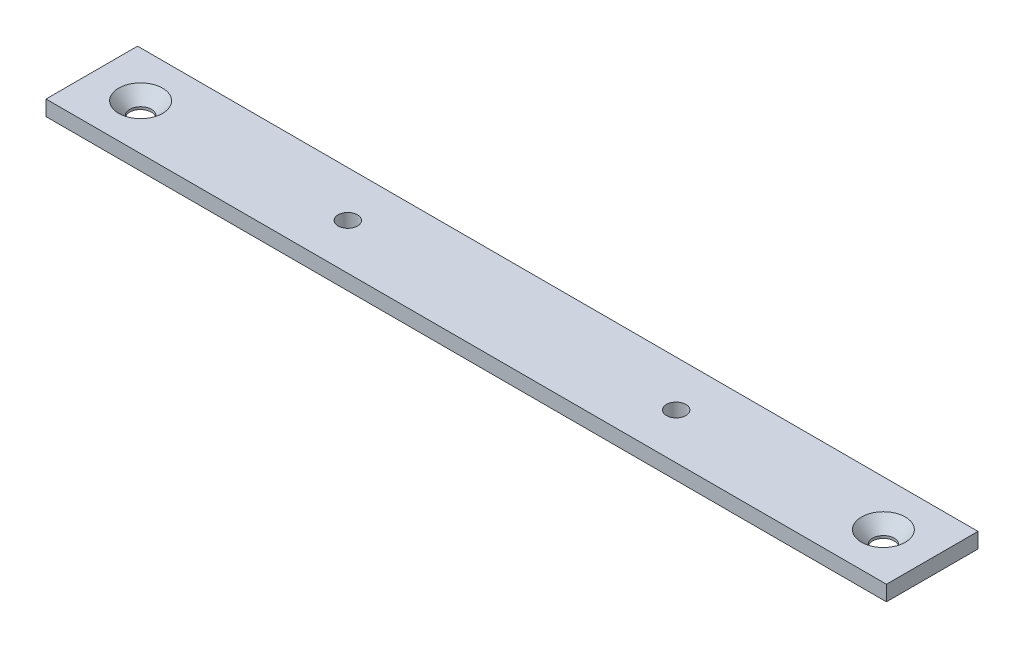
ISO-10303-21;
HEADER;
FILE_DESCRIPTION(('STEP AP214'),'2;1');
FILE_NAME('part.step','',(''),(''),'','','');
FILE_SCHEMA(('AUTOMOTIVE_DESIGN { 1 0 10303 214 1 1 1 1 }'));
ENDSEC;
DATA;
#1=APPLICATION_CONTEXT('core data for automotive mechanical design processes');
#2=APPLICATION_PROTOCOL_DEFINITION('international standard','automotive_design',2000,#1);
#3=PRODUCT_CONTEXT('',#1,'mechanical');
#4=PRODUCT('Part','Part','',(#3));
#5=PRODUCT_RELATED_PRODUCT_CATEGORY('part','',(#4));
#6=PRODUCT_DEFINITION_FORMATION('','',#4);
#7=PRODUCT_DEFINITION_CONTEXT('part definition',#1,'design');
#8=PRODUCT_DEFINITION('design','',#6,#7);
#9=PRODUCT_DEFINITION_SHAPE('','',#8);
#10=(LENGTH_UNIT() NAMED_UNIT(*) SI_UNIT(.MILLI.,.METRE.));
#11=(NAMED_UNIT(*) PLANE_ANGLE_UNIT() SI_UNIT($,.RADIAN.));
#12=(NAMED_UNIT(*) SI_UNIT($,.STERADIAN.) SOLID_ANGLE_UNIT());
#13=UNCERTAINTY_MEASURE_WITH_UNIT(LENGTH_MEASURE(1.E-05),#10,'distance_accuracy_value','');
#14=(GEOMETRIC_REPRESENTATION_CONTEXT(3) GLOBAL_UNCERTAINTY_ASSIGNED_CONTEXT((#13)) GLOBAL_UNIT_ASSIGNED_CONTEXT((#10,
#11,#12)) REPRESENTATION_CONTEXT('',''));
#15=CARTESIAN_POINT('',(0.,0.,0.));
#16=DIRECTION('',(0.,0.,1.));
#17=DIRECTION('',(1.,0.,0.));
#18=AXIS2_PLACEMENT_3D('',#15,#16,#17);
#19=CARTESIAN_POINT('',(87.4395,3.175,9.525));
#20=DIRECTION('',(-1.,0.,0.));
#21=DIRECTION('',(0.,0.,1.));
#22=AXIS2_PLACEMENT_3D('',#19,#20,#21);
#23=PLANE('',#22);
#24=DIRECTION('',(0.,0.,-1.));
#25=VECTOR('',#24,1.);
#26=CARTESIAN_POINT('',(87.4395,0.,9.525));
#27=LINE('',#26,#25);
#28=CARTESIAN_POINT('',(87.4395,0.,9.525));
#29=VERTEX_POINT('',#28);
#30=CARTESIAN_POINT('',(87.4395,0.,-9.525));
#31=VERTEX_POINT('',#30);
#32=EDGE_CURVE('E104',#29,#31,#27,.T.);
#33=ORIENTED_EDGE('',*,*,#32,.T.);
#34=DIRECTION('',(0.,-1.,0.));
#35=VECTOR('',#34,1.);
#36=CARTESIAN_POINT('',(87.4395,3.175,-9.525));
#37=LINE('',#36,#35);
#38=CARTESIAN_POINT('',(87.4395,3.175,-9.525));
#39=VERTEX_POINT('',#38);
#40=EDGE_CURVE('E11',#39,#31,#37,.T.);
#41=ORIENTED_EDGE('',*,*,#40,.F.);
#42=DIRECTION('',(0.,0.,-1.));
#43=VECTOR('',#42,1.);
#44=CARTESIAN_POINT('',(87.4395,3.175,9.525));
#45=LINE('',#44,#43);
#46=CARTESIAN_POINT('',(87.4395,3.175,9.525));
#47=VERTEX_POINT('',#46);
#48=EDGE_CURVE('E91',#47,#39,#45,.T.);
#49=ORIENTED_EDGE('',*,*,#48,.F.);
#50=DIRECTION('',(0.,-1.,0.));
#51=VECTOR('',#50,1.);
#52=CARTESIAN_POINT('',(87.4395,3.175,9.525));
#53=LINE('',#52,#51);
#54=EDGE_CURVE('E100',#47,#29,#53,.T.);
#55=ORIENTED_EDGE('',*,*,#54,.T.);
#56=EDGE_LOOP('',(#33,#41,#49,#55));
#57=FACE_BOUND('',#56,.T.);
#58=ADVANCED_FACE('F39',(#57),#23,.F.);
#59=CARTESIAN_POINT('',(-87.4395,3.175,-9.525));
#60=DIRECTION('',(0.,0.,1.));
#61=DIRECTION('',(1.,0.,0.));
#62=AXIS2_PLACEMENT_3D('',#59,#60,#61);
#63=PLANE('',#62);
#64=DIRECTION('',(-1.,0.,0.));
#65=VECTOR('',#64,1.);
#66=CARTESIAN_POINT('',(-87.4395,0.,-9.525));
#67=LINE('',#66,#65);
#68=CARTESIAN_POINT('',(-87.4395,0.,-9.525));
#69=VERTEX_POINT('',#68);
#70=EDGE_CURVE('E95',#31,#69,#67,.T.);
#71=ORIENTED_EDGE('',*,*,#70,.T.);
#72=DIRECTION('',(0.,-1.,0.));
#73=VECTOR('',#72,1.);
#74=CARTESIAN_POINT('',(-87.4395,3.175,-9.525));
#75=LINE('',#74,#73);
#76=CARTESIAN_POINT('',(-87.4395,3.175,-9.525));
#77=VERTEX_POINT('',#76);
#78=EDGE_CURVE('E48',#77,#69,#75,.T.);
#79=ORIENTED_EDGE('',*,*,#78,.F.);
#80=DIRECTION('',(-1.,0.,0.));
#81=VECTOR('',#80,1.);
#82=CARTESIAN_POINT('',(-87.4395,3.175,-9.525));
#83=LINE('',#82,#81);
#84=EDGE_CURVE('E86',#39,#77,#83,.T.);
#85=ORIENTED_EDGE('',*,*,#84,.F.);
#86=ORIENTED_EDGE('',*,*,#40,.T.);
#87=EDGE_LOOP('',(#71,#79,#85,#86));
#88=FACE_BOUND('',#87,.T.);
#89=ADVANCED_FACE('F94',(#88),#63,.F.);
#90=CARTESIAN_POINT('',(-87.4395,3.175,9.525));
#91=DIRECTION('',(1.,0.,0.));
#92=DIRECTION('',(0.,0.,-1.));
#93=AXIS2_PLACEMENT_3D('',#90,#91,#92);
#94=PLANE('',#93);
#95=DIRECTION('',(0.,0.,1.));
#96=VECTOR('',#95,1.);
#97=CARTESIAN_POINT('',(-87.4395,0.,9.525));
#98=LINE('',#97,#96);
#99=CARTESIAN_POINT('',(-87.4395,0.,9.525));
#100=VERTEX_POINT('',#99);
#101=EDGE_CURVE('E73',#69,#100,#98,.T.);
#102=ORIENTED_EDGE('',*,*,#101,.T.);
#103=DIRECTION('',(0.,-1.,0.));
#104=VECTOR('',#103,1.);
#105=CARTESIAN_POINT('',(-87.4395,3.175,9.525));
#106=LINE('',#105,#104);
#107=CARTESIAN_POINT('',(-87.4395,3.175,9.525));
#108=VERTEX_POINT('',#107);
#109=EDGE_CURVE('E96',#108,#100,#106,.T.);
#110=ORIENTED_EDGE('',*,*,#109,.F.);
#111=DIRECTION('',(0.,0.,1.));
#112=VECTOR('',#111,1.);
#113=CARTESIAN_POINT('',(-87.4395,3.175,9.525));
#114=LINE('',#113,#112);
#115=EDGE_CURVE('E89',#77,#108,#114,.T.);
#116=ORIENTED_EDGE('',*,*,#115,.F.);
#117=ORIENTED_EDGE('',*,*,#78,.T.);
#118=EDGE_LOOP('',(#102,#110,#116,#117));
#119=FACE_BOUND('',#118,.T.);
#120=ADVANCED_FACE('F98',(#119),#94,.F.);
#121=CARTESIAN_POINT('',(-87.4395,3.175,9.525));
#122=DIRECTION('',(0.,0.,-1.));
#123=DIRECTION('',(-1.,0.,0.));
#124=AXIS2_PLACEMENT_3D('',#121,#122,#123);
#125=PLANE('',#124);
#126=DIRECTION('',(1.,0.,0.));
#127=VECTOR('',#126,1.);
#128=CARTESIAN_POINT('',(-87.4395,0.,9.525));
#129=LINE('',#128,#127);
#130=EDGE_CURVE('E79',#100,#29,#129,.T.);
#131=ORIENTED_EDGE('',*,*,#130,.T.);
#132=ORIENTED_EDGE('',*,*,#54,.F.);
#133=DIRECTION('',(1.,0.,0.));
#134=VECTOR('',#133,1.);
#135=CARTESIAN_POINT('',(-87.4395,3.175,9.525));
#136=LINE('',#135,#134);
#137=EDGE_CURVE('E56',#108,#47,#136,.T.);
#138=ORIENTED_EDGE('',*,*,#137,.F.);
#139=ORIENTED_EDGE('',*,*,#109,.T.);
#140=EDGE_LOOP('',(#131,#132,#138,#139));
#141=FACE_BOUND('',#140,.T.);
#142=ADVANCED_FACE('F112',(#141),#125,.F.);
#143=CARTESIAN_POINT('',(87.4395,3.175,-9.525));
#144=DIRECTION('',(0.,-1.,0.));
#145=DIRECTION('',(0.,0.,-1.));
#146=AXIS2_PLACEMENT_3D('',#143,#144,#145);
#147=PLANE('',#146);
#148=CARTESIAN_POINT('',(-77.2795,3.175,0.));
#149=DIRECTION('',(0.,1.,0.));
#150=DIRECTION('',(0.,0.,1.));
#151=AXIS2_PLACEMENT_3D('',#148,#149,#150);
#152=CIRCLE('',#151,4.5593);
#153=CARTESIAN_POINT('',(-77.2795,3.175,4.5593));
#154=VERTEX_POINT('',#153);
#155=EDGE_CURVE('E141',#154,#154,#152,.T.);
#156=ORIENTED_EDGE('',*,*,#155,.F.);
#157=EDGE_LOOP('',(#156));
#158=FACE_BOUND('',#157,.T.);
#159=CARTESIAN_POINT('',(77.2794999999999,3.175,0.));
#160=DIRECTION('',(0.,1.,0.));
#161=DIRECTION('',(0.,0.,1.));
#162=AXIS2_PLACEMENT_3D('',#159,#160,#161);
#163=CIRCLE('',#162,4.5593);
#164=CARTESIAN_POINT('',(77.2794999999999,3.175,4.5593));
#165=VERTEX_POINT('',#164);
#166=EDGE_CURVE('E132',#165,#165,#163,.T.);
#167=ORIENTED_EDGE('',*,*,#166,.F.);
#168=EDGE_LOOP('',(#167));
#169=FACE_BOUND('',#168,.T.);
#170=CARTESIAN_POINT('',(-34.163,3.175,0.));
#171=DIRECTION('',(0.,1.,0.));
#172=DIRECTION('',(0.,0.,1.));
#173=AXIS2_PLACEMENT_3D('',#170,#171,#172);
#174=CIRCLE('',#173,2.0193);
#175=CARTESIAN_POINT('',(-34.163,3.175,2.0193));
#176=VERTEX_POINT('',#175);
#177=EDGE_CURVE('E123',#176,#176,#174,.T.);
#178=ORIENTED_EDGE('',*,*,#177,.F.);
#179=EDGE_LOOP('',(#178));
#180=FACE_BOUND('',#179,.T.);
#181=CARTESIAN_POINT('',(34.163,3.175,0.));
#182=DIRECTION('',(0.,1.,0.));
#183=DIRECTION('',(0.,0.,1.));
#184=AXIS2_PLACEMENT_3D('',#181,#182,#183);
#185=CIRCLE('',#184,2.0193);
#186=CARTESIAN_POINT('',(34.163,3.175,2.0193));
#187=VERTEX_POINT('',#186);
#188=EDGE_CURVE('E120',#187,#187,#185,.T.);
#189=ORIENTED_EDGE('',*,*,#188,.F.);
#190=EDGE_LOOP('',(#189));
#191=FACE_BOUND('',#190,.T.);
#192=ORIENTED_EDGE('',*,*,#48,.T.);
#193=ORIENTED_EDGE('',*,*,#84,.T.);
#194=ORIENTED_EDGE('',*,*,#115,.T.);
#195=ORIENTED_EDGE('',*,*,#137,.T.);
#196=EDGE_LOOP('',(#192,#193,#194,#195));
#197=FACE_BOUND('',#196,.T.);
#198=ADVANCED_FACE('F87',(#158,#169,#180,#191,#197),#147,.F.);
#199=CARTESIAN_POINT('',(87.4395,0.,-9.525));
#200=DIRECTION('',(0.,-1.,0.));
#201=DIRECTION('',(0.,0.,-1.));
#202=AXIS2_PLACEMENT_3D('',#199,#200,#201);
#203=PLANE('',#202);
#204=CARTESIAN_POINT('',(-77.2795,1.18221404887819E-12,0.));
#205=DIRECTION('',(0.,1.,0.));
#206=DIRECTION('',(0.,0.,1.));
#207=AXIS2_PLACEMENT_3D('',#204,#205,#206);
#208=CIRCLE('',#207,2.2479);
#209=CARTESIAN_POINT('',(-77.2795,1.18221404887819E-12,2.2479));
#210=VERTEX_POINT('',#209);
#211=EDGE_CURVE('E135',#210,#210,#208,.T.);
#212=ORIENTED_EDGE('',*,*,#211,.T.);
#213=EDGE_LOOP('',(#212));
#214=FACE_BOUND('',#213,.T.);
#215=CARTESIAN_POINT('',(77.2794999999999,1.18221404887819E-12,0.));
#216=DIRECTION('',(0.,1.,0.));
#217=DIRECTION('',(0.,0.,1.));
#218=AXIS2_PLACEMENT_3D('',#215,#216,#217);
#219=CIRCLE('',#218,2.2479);
#220=CARTESIAN_POINT('',(77.2794999999999,1.18221404887819E-12,2.2479));
#221=VERTEX_POINT('',#220);
#222=EDGE_CURVE('E126',#221,#221,#219,.T.);
#223=ORIENTED_EDGE('',*,*,#222,.T.);
#224=EDGE_LOOP('',(#223));
#225=FACE_BOUND('',#224,.T.);
#226=CARTESIAN_POINT('',(-34.163,0.,0.));
#227=DIRECTION('',(0.,-1.,0.));
#228=DIRECTION('',(0.,0.,-1.));
#229=AXIS2_PLACEMENT_3D('',#226,#227,#228);
#230=CIRCLE('',#229,2.0193);
#231=CARTESIAN_POINT('',(-34.163,0.,-2.0193));
#232=VERTEX_POINT('',#231);
#233=EDGE_CURVE('E42',#232,#232,#230,.T.);
#234=ORIENTED_EDGE('',*,*,#233,.F.);
#235=EDGE_LOOP('',(#234));
#236=FACE_BOUND('',#235,.T.);
#237=CARTESIAN_POINT('',(34.163,0.,0.));
#238=DIRECTION('',(0.,-1.,0.));
#239=DIRECTION('',(0.,0.,-1.));
#240=AXIS2_PLACEMENT_3D('',#237,#238,#239);
#241=CIRCLE('',#240,2.0193);
#242=CARTESIAN_POINT('',(34.163,0.,-2.0193));
#243=VERTEX_POINT('',#242);
#244=EDGE_CURVE('E107',#243,#243,#241,.T.);
#245=ORIENTED_EDGE('',*,*,#244,.F.);
#246=EDGE_LOOP('',(#245));
#247=FACE_BOUND('',#246,.T.);
#248=ORIENTED_EDGE('',*,*,#32,.F.);
#249=ORIENTED_EDGE('',*,*,#130,.F.);
#250=ORIENTED_EDGE('',*,*,#101,.F.);
#251=ORIENTED_EDGE('',*,*,#70,.F.);
#252=EDGE_LOOP('',(#248,#249,#250,#251));
#253=FACE_BOUND('',#252,.T.);
#254=ADVANCED_FACE('F115',(#214,#225,#236,#247,#253),#203,.T.);
#255=CARTESIAN_POINT('',(34.163,3.175,0.));
#256=DIRECTION('',(0.,1.,0.));
#257=DIRECTION('',(0.,0.,1.));
#258=AXIS2_PLACEMENT_3D('',#255,#256,#257);
#259=CYLINDRICAL_SURFACE('',#258,2.0193);
#260=ORIENTED_EDGE('',*,*,#244,.T.);
#261=EDGE_LOOP('',(#260));
#262=FACE_BOUND('',#261,.T.);
#263=ORIENTED_EDGE('',*,*,#188,.T.);
#264=EDGE_LOOP('',(#263));
#265=FACE_BOUND('',#264,.T.);
#266=ADVANCED_FACE('F156',(#262,#265),#259,.F.);
#267=CARTESIAN_POINT('',(-34.163,3.175,0.));
#268=DIRECTION('',(0.,1.,0.));
#269=DIRECTION('',(0.,0.,1.));
#270=AXIS2_PLACEMENT_3D('',#267,#268,#269);
#271=CYLINDRICAL_SURFACE('',#270,2.0193);
#272=ORIENTED_EDGE('',*,*,#233,.T.);
#273=EDGE_LOOP('',(#272));
#274=FACE_BOUND('',#273,.T.);
#275=ORIENTED_EDGE('',*,*,#177,.T.);
#276=EDGE_LOOP('',(#275));
#277=FACE_BOUND('',#276,.T.);
#278=ADVANCED_FACE('F158',(#274,#277),#271,.F.);
#279=CARTESIAN_POINT('',(77.2794999999999,3.175,0.));
#280=DIRECTION('',(0.,1.,0.));
#281=DIRECTION('',(0.,0.,1.));
#282=AXIS2_PLACEMENT_3D('',#279,#280,#281);
#283=CYLINDRICAL_SURFACE('',#282,2.24789999999999);
#284=ORIENTED_EDGE('',*,*,#222,.F.);
#285=EDGE_LOOP('',(#284));
#286=FACE_BOUND('',#285,.T.);
#287=CARTESIAN_POINT('',(77.2794999999999,0.516038463549351,0.));
#288=DIRECTION('',(0.,1.,0.));
#289=DIRECTION('',(0.,0.,1.));
#290=AXIS2_PLACEMENT_3D('',#287,#288,#289);
#291=CIRCLE('',#290,2.24789999999998);
#292=CARTESIAN_POINT('',(77.2794999999999,0.516038463549351,2.24789999999998));
#293=VERTEX_POINT('',#292);
#294=EDGE_CURVE('E129',#293,#293,#291,.T.);
#295=ORIENTED_EDGE('',*,*,#294,.T.);
#296=EDGE_LOOP('',(#295));
#297=FACE_BOUND('',#296,.T.);
#298=ADVANCED_FACE('F165',(#286,#297),#283,.F.);
#299=CARTESIAN_POINT('',(77.2794999999999,3.175,0.));
#300=DIRECTION('',(0.,1.,0.));
#301=DIRECTION('',(0.,0.,1.));
#302=AXIS2_PLACEMENT_3D('',#299,#300,#301);
#303=CONICAL_SURFACE('',#302,4.5593,0.715584993317677);
#304=ORIENTED_EDGE('',*,*,#294,.F.);
#305=EDGE_LOOP('',(#304));
#306=FACE_BOUND('',#305,.T.);
#307=ORIENTED_EDGE('',*,*,#166,.T.);
#308=EDGE_LOOP('',(#307));
#309=FACE_BOUND('',#308,.T.);
#310=ADVANCED_FACE('F255',(#306,#309),#303,.F.);
#311=CARTESIAN_POINT('',(-77.2795,3.175,0.));
#312=DIRECTION('',(0.,1.,0.));
#313=DIRECTION('',(0.,0.,1.));
#314=AXIS2_PLACEMENT_3D('',#311,#312,#313);
#315=CYLINDRICAL_SURFACE('',#314,2.24789999999999);
#316=ORIENTED_EDGE('',*,*,#211,.F.);
#317=EDGE_LOOP('',(#316));
#318=FACE_BOUND('',#317,.T.);
#319=CARTESIAN_POINT('',(-77.2795,0.516038463549351,0.));
#320=DIRECTION('',(0.,1.,0.));
#321=DIRECTION('',(0.,0.,1.));
#322=AXIS2_PLACEMENT_3D('',#319,#320,#321);
#323=CIRCLE('',#322,2.24789999999998);
#324=CARTESIAN_POINT('',(-77.2795,0.516038463549351,2.24789999999998));
#325=VERTEX_POINT('',#324);
#326=EDGE_CURVE('E138',#325,#325,#323,.T.);
#327=ORIENTED_EDGE('',*,*,#326,.T.);
#328=EDGE_LOOP('',(#327));
#329=FACE_BOUND('',#328,.T.);
#330=ADVANCED_FACE('F244',(#318,#329),#315,.F.);
#331=CARTESIAN_POINT('',(-77.2795,3.175,0.));
#332=DIRECTION('',(0.,1.,0.));
#333=DIRECTION('',(0.,0.,1.));
#334=AXIS2_PLACEMENT_3D('',#331,#332,#333);
#335=CONICAL_SURFACE('',#334,4.5593,0.715584993317677);
#336=ORIENTED_EDGE('',*,*,#326,.F.);
#337=EDGE_LOOP('',(#336));
#338=FACE_BOUND('',#337,.T.);
#339=ORIENTED_EDGE('',*,*,#155,.T.);
#340=EDGE_LOOP('',(#339));
#341=FACE_BOUND('',#340,.T.);
#342=ADVANCED_FACE('F145',(#338,#341),#335,.F.);
#343=CLOSED_SHELL('',(#58,#89,#120,#142,#198,#254,#266,#278,#298,#310,#330,#342));
#344=MANIFOLD_SOLID_BREP('B2',#343);
#345=ADVANCED_BREP_SHAPE_REPRESENTATION('',(#18,#344),#14);
#346=SHAPE_DEFINITION_REPRESENTATION(#9,#345);
ENDSEC;
END-ISO-10303-21;
